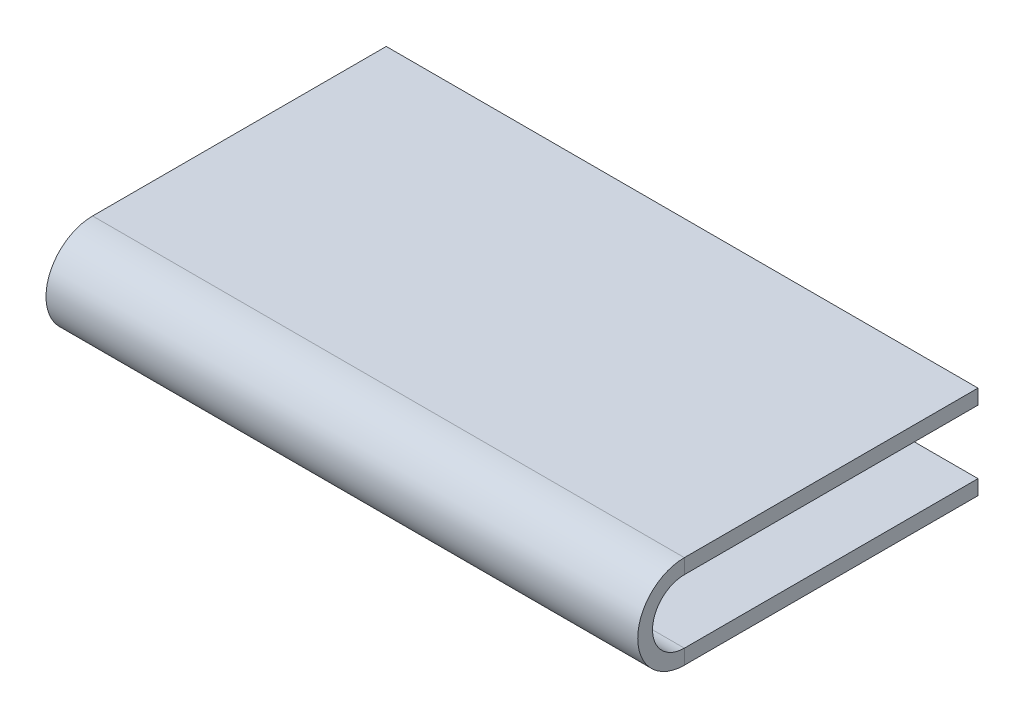
ISO-10303-21;
HEADER;
FILE_DESCRIPTION(('STEP AP214'),'2;1');
FILE_NAME('part.step','',(''),(''),'','','');
FILE_SCHEMA(('AUTOMOTIVE_DESIGN { 1 0 10303 214 1 1 1 1 }'));
ENDSEC;
DATA;
#1=APPLICATION_CONTEXT('core data for automotive mechanical design processes');
#2=APPLICATION_PROTOCOL_DEFINITION('international standard','automotive_design',2000,#1);
#3=PRODUCT_CONTEXT('',#1,'mechanical');
#4=PRODUCT('Part','Part','',(#3));
#5=PRODUCT_RELATED_PRODUCT_CATEGORY('part','',(#4));
#6=PRODUCT_DEFINITION_FORMATION('','',#4);
#7=PRODUCT_DEFINITION_CONTEXT('part definition',#1,'design');
#8=PRODUCT_DEFINITION('design','',#6,#7);
#9=PRODUCT_DEFINITION_SHAPE('','',#8);
#10=(LENGTH_UNIT() NAMED_UNIT(*) SI_UNIT(.MILLI.,.METRE.));
#11=(NAMED_UNIT(*) PLANE_ANGLE_UNIT() SI_UNIT($,.RADIAN.));
#12=(NAMED_UNIT(*) SI_UNIT($,.STERADIAN.) SOLID_ANGLE_UNIT());
#13=UNCERTAINTY_MEASURE_WITH_UNIT(LENGTH_MEASURE(1.E-05),#10,'distance_accuracy_value','');
#14=(GEOMETRIC_REPRESENTATION_CONTEXT(3) GLOBAL_UNCERTAINTY_ASSIGNED_CONTEXT((#13)) GLOBAL_UNIT_ASSIGNED_CONTEXT((#10,
#11,#12)) REPRESENTATION_CONTEXT('',''));
#15=CARTESIAN_POINT('',(0.,0.,0.));
#16=DIRECTION('',(0.,0.,1.));
#17=DIRECTION('',(1.,0.,0.));
#18=AXIS2_PLACEMENT_3D('',#15,#16,#17);
#19=CARTESIAN_POINT('',(40.,0.,19.85));
#20=DIRECTION('',(1.,0.,0.));
#21=DIRECTION('',(0.,0.,-1.));
#22=AXIS2_PLACEMENT_3D('',#19,#20,#21);
#23=PLANE('',#22);
#24=DIRECTION('',(0.,-1.,0.));
#25=VECTOR('',#24,1.);
#26=CARTESIAN_POINT('',(40.,0.,19.85));
#27=LINE('',#26,#25);
#28=CARTESIAN_POINT('',(40.,0.,19.85));
#29=VERTEX_POINT('',#28);
#30=CARTESIAN_POINT('',(40.,-1.,19.85));
#31=VERTEX_POINT('',#30);
#32=EDGE_CURVE('E11',#29,#31,#27,.T.);
#33=ORIENTED_EDGE('',*,*,#32,.F.);
#34=CARTESIAN_POINT('',(40.,2.15,19.85));
#35=DIRECTION('',(1.,0.,0.));
#36=DIRECTION('',(0.,0.,-1.));
#37=AXIS2_PLACEMENT_3D('',#34,#35,#36);
#38=CIRCLE('',#37,2.15);
#39=CARTESIAN_POINT('',(40.,4.29999999999999,19.85));
#40=VERTEX_POINT('',#39);
#41=EDGE_CURVE('E136',#40,#29,#38,.T.);
#42=ORIENTED_EDGE('',*,*,#41,.F.);
#43=DIRECTION('',(0.,-1.,0.));
#44=VECTOR('',#43,1.);
#45=CARTESIAN_POINT('',(40.,5.29999999999999,19.85));
#46=LINE('',#45,#44);
#47=CARTESIAN_POINT('',(40.,5.29999999999999,19.85));
#48=VERTEX_POINT('',#47);
#49=EDGE_CURVE('E51',#48,#40,#46,.T.);
#50=ORIENTED_EDGE('',*,*,#49,.F.);
#51=CARTESIAN_POINT('',(40.,2.15,19.85));
#52=DIRECTION('',(1.,0.,0.));
#53=DIRECTION('',(0.,1.,0.));
#54=AXIS2_PLACEMENT_3D('',#51,#52,#53);
#55=CIRCLE('',#54,3.15);
#56=EDGE_CURVE('E134',#48,#31,#55,.T.);
#57=ORIENTED_EDGE('',*,*,#56,.T.);
#58=EDGE_LOOP('',(#33,#42,#50,#57));
#59=FACE_BOUND('',#58,.T.);
#60=ADVANCED_FACE('F43',(#59),#23,.T.);
#61=CARTESIAN_POINT('',(40.,5.29999999999999,19.85));
#62=DIRECTION('',(1.,0.,0.));
#63=DIRECTION('',(0.,0.,-1.));
#64=AXIS2_PLACEMENT_3D('',#61,#62,#63);
#65=PLANE('',#64);
#66=DIRECTION('',(0.,0.,-1.));
#67=VECTOR('',#66,1.);
#68=CARTESIAN_POINT('',(40.,0.,0.));
#69=LINE('',#68,#67);
#70=CARTESIAN_POINT('',(40.,0.,0.));
#71=VERTEX_POINT('',#70);
#72=EDGE_CURVE('E186',#29,#71,#69,.T.);
#73=ORIENTED_EDGE('',*,*,#72,.F.);
#74=ORIENTED_EDGE('',*,*,#32,.T.);
#75=DIRECTION('',(0.,0.,1.));
#76=VECTOR('',#75,1.);
#77=CARTESIAN_POINT('',(40.,-1.,0.));
#78=LINE('',#77,#76);
#79=CARTESIAN_POINT('',(40.,-1.,0.));
#80=VERTEX_POINT('',#79);
#81=EDGE_CURVE('E97',#31,#80,#78,.F.);
#82=ORIENTED_EDGE('',*,*,#81,.T.);
#83=DIRECTION('',(0.,-1.,0.));
#84=VECTOR('',#83,1.);
#85=CARTESIAN_POINT('',(40.,0.,0.));
#86=LINE('',#85,#84);
#87=EDGE_CURVE('E347',#71,#80,#86,.T.);
#88=ORIENTED_EDGE('',*,*,#87,.F.);
#89=EDGE_LOOP('',(#73,#74,#82,#88));
#90=FACE_BOUND('',#89,.T.);
#91=ADVANCED_FACE('F197',(#90),#65,.T.);
#92=CARTESIAN_POINT('',(0.,4.29999999999999,19.85));
#93=DIRECTION('',(-1.,0.,0.));
#94=DIRECTION('',(0.,0.,1.));
#95=AXIS2_PLACEMENT_3D('',#92,#93,#94);
#96=PLANE('',#95);
#97=DIRECTION('',(0.,1.,0.));
#98=VECTOR('',#97,1.);
#99=CARTESIAN_POINT('',(0.,4.29999999999999,19.85));
#100=LINE('',#99,#98);
#101=CARTESIAN_POINT('',(0.,4.29999999999999,19.85));
#102=VERTEX_POINT('',#101);
#103=CARTESIAN_POINT('',(0.,5.29999999999999,19.85));
#104=VERTEX_POINT('',#103);
#105=EDGE_CURVE('E88',#102,#104,#100,.T.);
#106=ORIENTED_EDGE('',*,*,#105,.F.);
#107=CARTESIAN_POINT('',(0.,2.15,19.85));
#108=DIRECTION('',(1.,0.,0.));
#109=DIRECTION('',(0.,0.,-1.));
#110=AXIS2_PLACEMENT_3D('',#107,#108,#109);
#111=CIRCLE('',#110,2.15);
#112=CARTESIAN_POINT('',(0.,0.,19.85));
#113=VERTEX_POINT('',#112);
#114=EDGE_CURVE('E154',#102,#113,#111,.T.);
#115=ORIENTED_EDGE('',*,*,#114,.T.);
#116=DIRECTION('',(0.,1.,0.));
#117=VECTOR('',#116,1.);
#118=CARTESIAN_POINT('',(0.,-1.,19.85));
#119=LINE('',#118,#117);
#120=CARTESIAN_POINT('',(0.,-1.,19.85));
#121=VERTEX_POINT('',#120);
#122=EDGE_CURVE('E91',#121,#113,#119,.T.);
#123=ORIENTED_EDGE('',*,*,#122,.F.);
#124=CARTESIAN_POINT('',(0.,2.15,19.85));
#125=DIRECTION('',(1.,0.,0.));
#126=DIRECTION('',(0.,1.,0.));
#127=AXIS2_PLACEMENT_3D('',#124,#125,#126);
#128=CIRCLE('',#127,3.15);
#129=EDGE_CURVE('E165',#104,#121,#128,.T.);
#130=ORIENTED_EDGE('',*,*,#129,.F.);
#131=EDGE_LOOP('',(#106,#115,#123,#130));
#132=FACE_BOUND('',#131,.T.);
#133=ADVANCED_FACE('F191',(#132),#96,.T.);
#134=CARTESIAN_POINT('',(0.,-1.,19.85));
#135=DIRECTION('',(-1.,0.,0.));
#136=DIRECTION('',(0.,0.,1.));
#137=AXIS2_PLACEMENT_3D('',#134,#135,#136);
#138=PLANE('',#137);
#139=DIRECTION('',(0.,0.,1.));
#140=VECTOR('',#139,1.);
#141=CARTESIAN_POINT('',(0.,4.3,0.));
#142=LINE('',#141,#140);
#143=CARTESIAN_POINT('',(0.,4.3,0.));
#144=VERTEX_POINT('',#143);
#145=EDGE_CURVE('E160',#144,#102,#142,.T.);
#146=ORIENTED_EDGE('',*,*,#145,.T.);
#147=ORIENTED_EDGE('',*,*,#105,.T.);
#148=DIRECTION('',(0.,0.,1.));
#149=VECTOR('',#148,1.);
#150=CARTESIAN_POINT('',(0.,5.3,0.));
#151=LINE('',#150,#149);
#152=CARTESIAN_POINT('',(0.,5.3,0.));
#153=VERTEX_POINT('',#152);
#154=EDGE_CURVE('E159',#153,#104,#151,.T.);
#155=ORIENTED_EDGE('',*,*,#154,.F.);
#156=DIRECTION('',(0.,-1.,0.));
#157=VECTOR('',#156,1.);
#158=CARTESIAN_POINT('',(0.,5.3,0.));
#159=LINE('',#158,#157);
#160=EDGE_CURVE('E123',#153,#144,#159,.T.);
#161=ORIENTED_EDGE('',*,*,#160,.T.);
#162=EDGE_LOOP('',(#146,#147,#155,#161));
#163=FACE_BOUND('',#162,.T.);
#164=ADVANCED_FACE('F192',(#163),#138,.T.);
#165=CARTESIAN_POINT('',(40.,-1.,0.));
#166=DIRECTION('',(0.,1.,0.));
#167=DIRECTION('',(0.,0.,1.));
#168=AXIS2_PLACEMENT_3D('',#165,#166,#167);
#169=PLANE('',#168);
#170=DIRECTION('',(0.,0.,1.));
#171=VECTOR('',#170,1.);
#172=CARTESIAN_POINT('',(0.,-1.,0.));
#173=LINE('',#172,#171);
#174=CARTESIAN_POINT('',(0.,-1.,0.));
#175=VERTEX_POINT('',#174);
#176=EDGE_CURVE('E148',#121,#175,#173,.F.);
#177=ORIENTED_EDGE('',*,*,#176,.T.);
#178=DIRECTION('',(-1.,0.,0.));
#179=VECTOR('',#178,1.);
#180=CARTESIAN_POINT('',(40.,-1.,0.));
#181=LINE('',#180,#179);
#182=EDGE_CURVE('E178',#80,#175,#181,.T.);
#183=ORIENTED_EDGE('',*,*,#182,.F.);
#184=ORIENTED_EDGE('',*,*,#81,.F.);
#185=DIRECTION('',(-1.,0.,0.));
#186=VECTOR('',#185,1.);
#187=CARTESIAN_POINT('',(40.,-1.,19.85));
#188=LINE('',#187,#186);
#189=EDGE_CURVE('E144',#31,#121,#188,.T.);
#190=ORIENTED_EDGE('',*,*,#189,.T.);
#191=EDGE_LOOP('',(#177,#183,#184,#190));
#192=FACE_BOUND('',#191,.T.);
#193=ADVANCED_FACE('F201',(#192),#169,.F.);
#194=CARTESIAN_POINT('',(40.,0.,0.));
#195=DIRECTION('',(0.,0.,-1.));
#196=DIRECTION('',(-1.,0.,0.));
#197=AXIS2_PLACEMENT_3D('',#194,#195,#196);
#198=PLANE('',#197);
#199=DIRECTION('',(0.,-1.,0.));
#200=VECTOR('',#199,1.);
#201=CARTESIAN_POINT('',(0.,0.,0.));
#202=LINE('',#201,#200);
#203=CARTESIAN_POINT('',(0.,0.,0.));
#204=VERTEX_POINT('',#203);
#205=EDGE_CURVE('E149',#204,#175,#202,.T.);
#206=ORIENTED_EDGE('',*,*,#205,.F.);
#207=DIRECTION('',(-1.,0.,0.));
#208=VECTOR('',#207,1.);
#209=CARTESIAN_POINT('',(40.,0.,0.));
#210=LINE('',#209,#208);
#211=EDGE_CURVE('E173',#71,#204,#210,.T.);
#212=ORIENTED_EDGE('',*,*,#211,.F.);
#213=ORIENTED_EDGE('',*,*,#87,.T.);
#214=ORIENTED_EDGE('',*,*,#182,.T.);
#215=EDGE_LOOP('',(#206,#212,#213,#214));
#216=FACE_BOUND('',#215,.T.);
#217=ADVANCED_FACE('F237',(#216),#198,.T.);
#218=CARTESIAN_POINT('',(40.,0.,0.));
#219=DIRECTION('',(0.,1.,0.));
#220=DIRECTION('',(0.,0.,1.));
#221=AXIS2_PLACEMENT_3D('',#218,#219,#220);
#222=PLANE('',#221);
#223=DIRECTION('',(0.,0.,-1.));
#224=VECTOR('',#223,1.);
#225=CARTESIAN_POINT('',(0.,0.,0.));
#226=LINE('',#225,#224);
#227=EDGE_CURVE('E155',#113,#204,#226,.T.);
#228=ORIENTED_EDGE('',*,*,#227,.F.);
#229=DIRECTION('',(-1.,0.,0.));
#230=VECTOR('',#229,1.);
#231=CARTESIAN_POINT('',(40.,0.,19.85));
#232=LINE('',#231,#230);
#233=EDGE_CURVE('E174',#29,#113,#232,.T.);
#234=ORIENTED_EDGE('',*,*,#233,.F.);
#235=ORIENTED_EDGE('',*,*,#72,.T.);
#236=ORIENTED_EDGE('',*,*,#211,.T.);
#237=EDGE_LOOP('',(#228,#234,#235,#236));
#238=FACE_BOUND('',#237,.T.);
#239=ADVANCED_FACE('F250',(#238),#222,.T.);
#240=CARTESIAN_POINT('',(40.,2.15,19.85));
#241=DIRECTION('',(-1.,0.,0.));
#242=DIRECTION('',(0.,0.,1.));
#243=AXIS2_PLACEMENT_3D('',#240,#241,#242);
#244=CYLINDRICAL_SURFACE('',#243,2.15);
#245=ORIENTED_EDGE('',*,*,#114,.F.);
#246=DIRECTION('',(-1.,0.,0.));
#247=VECTOR('',#246,1.);
#248=CARTESIAN_POINT('',(40.,4.29999999999999,19.85));
#249=LINE('',#248,#247);
#250=EDGE_CURVE('E169',#40,#102,#249,.T.);
#251=ORIENTED_EDGE('',*,*,#250,.F.);
#252=ORIENTED_EDGE('',*,*,#41,.T.);
#253=ORIENTED_EDGE('',*,*,#233,.T.);
#254=EDGE_LOOP('',(#245,#251,#252,#253));
#255=FACE_BOUND('',#254,.T.);
#256=ADVANCED_FACE('F183',(#255),#244,.F.);
#257=CARTESIAN_POINT('',(40.,4.3,0.));
#258=DIRECTION('',(0.,-1.,0.));
#259=DIRECTION('',(0.,0.,-1.));
#260=AXIS2_PLACEMENT_3D('',#257,#258,#259);
#261=PLANE('',#260);
#262=ORIENTED_EDGE('',*,*,#145,.F.);
#263=DIRECTION('',(-1.,0.,0.));
#264=VECTOR('',#263,1.);
#265=CARTESIAN_POINT('',(40.,4.3,0.));
#266=LINE('',#265,#264);
#267=CARTESIAN_POINT('',(40.,4.3,0.));
#268=VERTEX_POINT('',#267);
#269=EDGE_CURVE('E121',#268,#144,#266,.T.);
#270=ORIENTED_EDGE('',*,*,#269,.F.);
#271=DIRECTION('',(0.,0.,1.));
#272=VECTOR('',#271,1.);
#273=CARTESIAN_POINT('',(40.,4.3,0.));
#274=LINE('',#273,#272);
#275=EDGE_CURVE('E138',#268,#40,#274,.T.);
#276=ORIENTED_EDGE('',*,*,#275,.T.);
#277=ORIENTED_EDGE('',*,*,#250,.T.);
#278=EDGE_LOOP('',(#262,#270,#276,#277));
#279=FACE_BOUND('',#278,.T.);
#280=ADVANCED_FACE('F188',(#279),#261,.T.);
#281=CARTESIAN_POINT('',(40.,5.3,0.));
#282=DIRECTION('',(0.,0.,-1.));
#283=DIRECTION('',(0.,1.,0.));
#284=AXIS2_PLACEMENT_3D('',#281,#282,#283);
#285=PLANE('',#284);
#286=ORIENTED_EDGE('',*,*,#160,.F.);
#287=DIRECTION('',(-1.,0.,0.));
#288=VECTOR('',#287,1.);
#289=CARTESIAN_POINT('',(40.,5.3,0.));
#290=LINE('',#289,#288);
#291=CARTESIAN_POINT('',(40.,5.3,0.));
#292=VERTEX_POINT('',#291);
#293=EDGE_CURVE('E113',#292,#153,#290,.T.);
#294=ORIENTED_EDGE('',*,*,#293,.F.);
#295=DIRECTION('',(0.,-1.,0.));
#296=VECTOR('',#295,1.);
#297=CARTESIAN_POINT('',(40.,5.3,0.));
#298=LINE('',#297,#296);
#299=EDGE_CURVE('E118',#292,#268,#298,.T.);
#300=ORIENTED_EDGE('',*,*,#299,.T.);
#301=ORIENTED_EDGE('',*,*,#269,.T.);
#302=EDGE_LOOP('',(#286,#294,#300,#301));
#303=FACE_BOUND('',#302,.T.);
#304=ADVANCED_FACE('F116',(#303),#285,.T.);
#305=CARTESIAN_POINT('',(40.,5.3,0.));
#306=DIRECTION('',(0.,-1.,0.));
#307=DIRECTION('',(0.,0.,-1.));
#308=AXIS2_PLACEMENT_3D('',#305,#306,#307);
#309=PLANE('',#308);
#310=ORIENTED_EDGE('',*,*,#154,.T.);
#311=DIRECTION('',(-1.,0.,0.));
#312=VECTOR('',#311,1.);
#313=CARTESIAN_POINT('',(40.,5.29999999999999,19.85));
#314=LINE('',#313,#312);
#315=EDGE_CURVE('E122',#48,#104,#314,.T.);
#316=ORIENTED_EDGE('',*,*,#315,.F.);
#317=DIRECTION('',(0.,0.,1.));
#318=VECTOR('',#317,1.);
#319=CARTESIAN_POINT('',(40.,5.3,0.));
#320=LINE('',#319,#318);
#321=EDGE_CURVE('E126',#292,#48,#320,.T.);
#322=ORIENTED_EDGE('',*,*,#321,.F.);
#323=ORIENTED_EDGE('',*,*,#293,.T.);
#324=EDGE_LOOP('',(#310,#316,#322,#323));
#325=FACE_BOUND('',#324,.T.);
#326=ADVANCED_FACE('F129',(#325),#309,.F.);
#327=CARTESIAN_POINT('',(40.,2.15,19.85));
#328=DIRECTION('',(-1.,0.,0.));
#329=DIRECTION('',(0.,0.,1.));
#330=AXIS2_PLACEMENT_3D('',#327,#328,#329);
#331=CYLINDRICAL_SURFACE('',#330,3.15);
#332=ORIENTED_EDGE('',*,*,#129,.T.);
#333=ORIENTED_EDGE('',*,*,#189,.F.);
#334=ORIENTED_EDGE('',*,*,#56,.F.);
#335=ORIENTED_EDGE('',*,*,#315,.T.);
#336=EDGE_LOOP('',(#332,#333,#334,#335));
#337=FACE_BOUND('',#336,.T.);
#338=ADVANCED_FACE('F193',(#337),#331,.T.);
#339=CARTESIAN_POINT('',(40.,2.15,19.85));
#340=DIRECTION('',(1.,0.,0.));
#341=DIRECTION('',(0.,1.,0.));
#342=AXIS2_PLACEMENT_3D('',#339,#340,#341);
#343=PLANE('',#342);
#344=ORIENTED_EDGE('',*,*,#321,.T.);
#345=ORIENTED_EDGE('',*,*,#49,.T.);
#346=ORIENTED_EDGE('',*,*,#275,.F.);
#347=ORIENTED_EDGE('',*,*,#299,.F.);
#348=EDGE_LOOP('',(#344,#345,#346,#347));
#349=FACE_BOUND('',#348,.T.);
#350=ADVANCED_FACE('F137',(#349),#343,.T.);
#351=CARTESIAN_POINT('',(0.,2.15,19.85));
#352=DIRECTION('',(1.,0.,0.));
#353=DIRECTION('',(0.,1.,0.));
#354=AXIS2_PLACEMENT_3D('',#351,#352,#353);
#355=PLANE('',#354);
#356=ORIENTED_EDGE('',*,*,#176,.F.);
#357=ORIENTED_EDGE('',*,*,#122,.T.);
#358=ORIENTED_EDGE('',*,*,#227,.T.);
#359=ORIENTED_EDGE('',*,*,#205,.T.);
#360=EDGE_LOOP('',(#356,#357,#358,#359));
#361=FACE_BOUND('',#360,.T.);
#362=ADVANCED_FACE('F311',(#361),#355,.F.);
#363=CLOSED_SHELL('',(#60,#91,#133,#164,#193,#217,#239,#256,#280,#304,#326,#338,#350,#362));
#364=MANIFOLD_SOLID_BREP('B2',#363);
#365=ADVANCED_BREP_SHAPE_REPRESENTATION('',(#18,#364),#14);
#366=SHAPE_DEFINITION_REPRESENTATION(#9,#365);
ENDSEC;
END-ISO-10303-21;
